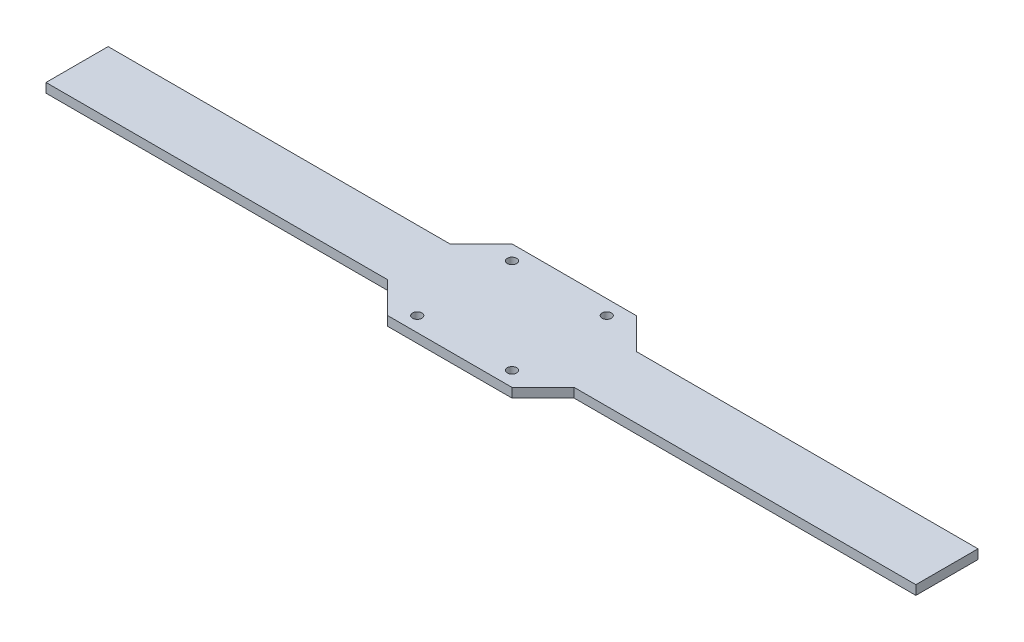
ISO-10303-21;
HEADER;
FILE_DESCRIPTION(('STEP AP214'),'2;1');
FILE_NAME('part.step','',(''),(''),'','','');
FILE_SCHEMA(('AUTOMOTIVE_DESIGN { 1 0 10303 214 1 1 1 1 }'));
ENDSEC;
DATA;
#1=APPLICATION_CONTEXT('core data for automotive mechanical design processes');
#2=APPLICATION_PROTOCOL_DEFINITION('international standard','automotive_design',2000,#1);
#3=PRODUCT_CONTEXT('',#1,'mechanical');
#4=PRODUCT('Part','Part','',(#3));
#5=PRODUCT_RELATED_PRODUCT_CATEGORY('part','',(#4));
#6=PRODUCT_DEFINITION_FORMATION('','',#4);
#7=PRODUCT_DEFINITION_CONTEXT('part definition',#1,'design');
#8=PRODUCT_DEFINITION('design','',#6,#7);
#9=PRODUCT_DEFINITION_SHAPE('','',#8);
#10=(LENGTH_UNIT() NAMED_UNIT(*) SI_UNIT(.MILLI.,.METRE.));
#11=(NAMED_UNIT(*) PLANE_ANGLE_UNIT() SI_UNIT($,.RADIAN.));
#12=(NAMED_UNIT(*) SI_UNIT($,.STERADIAN.) SOLID_ANGLE_UNIT());
#13=UNCERTAINTY_MEASURE_WITH_UNIT(LENGTH_MEASURE(1.E-05),#10,'distance_accuracy_value','');
#14=(GEOMETRIC_REPRESENTATION_CONTEXT(3) GLOBAL_UNCERTAINTY_ASSIGNED_CONTEXT((#13)) GLOBAL_UNIT_ASSIGNED_CONTEXT((#10,
#11,#12)) REPRESENTATION_CONTEXT('',''));
#15=CARTESIAN_POINT('',(0.,0.,0.));
#16=DIRECTION('',(0.,0.,1.));
#17=DIRECTION('',(1.,0.,0.));
#18=AXIS2_PLACEMENT_3D('',#15,#16,#17);
#19=CARTESIAN_POINT('',(140.,1.5,0.));
#20=DIRECTION('',(1.,0.,0.));
#21=DIRECTION('',(0.,0.,-1.));
#22=AXIS2_PLACEMENT_3D('',#19,#20,#21);
#23=PLANE('',#22);
#24=DIRECTION('',(0.,0.,1.));
#25=VECTOR('',#24,1.);
#26=CARTESIAN_POINT('',(140.,-1.5,0.));
#27=LINE('',#26,#25);
#28=CARTESIAN_POINT('',(140.,-1.5,-10.));
#29=VERTEX_POINT('',#28);
#30=CARTESIAN_POINT('',(140.,-1.5,10.));
#31=VERTEX_POINT('',#30);
#32=EDGE_CURVE('E164',#29,#31,#27,.T.);
#33=ORIENTED_EDGE('',*,*,#32,.F.);
#34=DIRECTION('',(0.,-1.,0.));
#35=VECTOR('',#34,1.);
#36=CARTESIAN_POINT('',(140.,1.5,-10.));
#37=LINE('',#36,#35);
#38=CARTESIAN_POINT('',(140.,1.5,-10.));
#39=VERTEX_POINT('',#38);
#40=EDGE_CURVE('E11',#39,#29,#37,.T.);
#41=ORIENTED_EDGE('',*,*,#40,.F.);
#42=DIRECTION('',(0.,0.,1.));
#43=VECTOR('',#42,1.);
#44=CARTESIAN_POINT('',(140.,1.5,0.));
#45=LINE('',#44,#43);
#46=CARTESIAN_POINT('',(140.,1.5,10.));
#47=VERTEX_POINT('',#46);
#48=EDGE_CURVE('E429',#39,#47,#45,.T.);
#49=ORIENTED_EDGE('',*,*,#48,.T.);
#50=DIRECTION('',(0.,-1.,0.));
#51=VECTOR('',#50,1.);
#52=CARTESIAN_POINT('',(140.,1.5,10.));
#53=LINE('',#52,#51);
#54=EDGE_CURVE('E51',#47,#31,#53,.T.);
#55=ORIENTED_EDGE('',*,*,#54,.T.);
#56=EDGE_LOOP('',(#33,#41,#49,#55));
#57=FACE_BOUND('',#56,.T.);
#58=ADVANCED_FACE('F34',(#57),#23,.T.);
#59=CARTESIAN_POINT('',(0.,1.5,-10.));
#60=DIRECTION('',(0.,0.,1.));
#61=DIRECTION('',(1.,0.,0.));
#62=AXIS2_PLACEMENT_3D('',#59,#60,#61);
#63=PLANE('',#62);
#64=DIRECTION('',(-1.,0.,0.));
#65=VECTOR('',#64,1.);
#66=CARTESIAN_POINT('',(0.,-1.5,-10.));
#67=LINE('',#66,#65);
#68=CARTESIAN_POINT('',(30.,-1.5,-10.));
#69=VERTEX_POINT('',#68);
#70=EDGE_CURVE('E166',#29,#69,#67,.T.);
#71=ORIENTED_EDGE('',*,*,#70,.T.);
#72=DIRECTION('',(0.,-1.,0.));
#73=VECTOR('',#72,1.);
#74=CARTESIAN_POINT('',(30.,1.5,-10.));
#75=LINE('',#74,#73);
#76=CARTESIAN_POINT('',(30.,1.5,-10.));
#77=VERTEX_POINT('',#76);
#78=EDGE_CURVE('E43',#77,#69,#75,.T.);
#79=ORIENTED_EDGE('',*,*,#78,.F.);
#80=DIRECTION('',(-1.,0.,0.));
#81=VECTOR('',#80,1.);
#82=CARTESIAN_POINT('',(0.,1.5,-10.));
#83=LINE('',#82,#81);
#84=EDGE_CURVE('E427',#39,#77,#83,.T.);
#85=ORIENTED_EDGE('',*,*,#84,.F.);
#86=ORIENTED_EDGE('',*,*,#40,.T.);
#87=EDGE_LOOP('',(#71,#79,#85,#86));
#88=FACE_BOUND('',#87,.T.);
#89=ADVANCED_FACE('F224',(#88),#63,.F.);
#90=CARTESIAN_POINT('',(20.,1.5,-20.));
#91=DIRECTION('',(-0.707106781186547,0.,0.707106781186547));
#92=DIRECTION('',(0.707106781186548,0.,0.707106781186548));
#93=AXIS2_PLACEMENT_3D('',#90,#91,#92);
#94=PLANE('',#93);
#95=DIRECTION('',(-0.707106781186548,0.,-0.707106781186548));
#96=VECTOR('',#95,1.);
#97=CARTESIAN_POINT('',(20.,-1.5,-20.));
#98=LINE('',#97,#96);
#99=CARTESIAN_POINT('',(20.,-1.5,-20.));
#100=VERTEX_POINT('',#99);
#101=EDGE_CURVE('E169',#69,#100,#98,.T.);
#102=ORIENTED_EDGE('',*,*,#101,.T.);
#103=DIRECTION('',(0.,-1.,0.));
#104=VECTOR('',#103,1.);
#105=CARTESIAN_POINT('',(20.,1.5,-20.));
#106=LINE('',#105,#104);
#107=CARTESIAN_POINT('',(20.,1.5,-20.));
#108=VERTEX_POINT('',#107);
#109=EDGE_CURVE('E212',#108,#100,#106,.T.);
#110=ORIENTED_EDGE('',*,*,#109,.F.);
#111=DIRECTION('',(-0.707106781186548,0.,-0.707106781186548));
#112=VECTOR('',#111,1.);
#113=CARTESIAN_POINT('',(20.,1.5,-20.));
#114=LINE('',#113,#112);
#115=EDGE_CURVE('E220',#77,#108,#114,.T.);
#116=ORIENTED_EDGE('',*,*,#115,.F.);
#117=ORIENTED_EDGE('',*,*,#78,.T.);
#118=EDGE_LOOP('',(#102,#110,#116,#117));
#119=FACE_BOUND('',#118,.T.);
#120=ADVANCED_FACE('F217',(#119),#94,.F.);
#121=CARTESIAN_POINT('',(0.,1.5,-20.));
#122=DIRECTION('',(0.,0.,1.));
#123=DIRECTION('',(1.,0.,0.));
#124=AXIS2_PLACEMENT_3D('',#121,#122,#123);
#125=PLANE('',#124);
#126=DIRECTION('',(-1.,0.,0.));
#127=VECTOR('',#126,1.);
#128=CARTESIAN_POINT('',(0.,-1.5,-20.));
#129=LINE('',#128,#127);
#130=CARTESIAN_POINT('',(-20.,-1.5,-20.));
#131=VERTEX_POINT('',#130);
#132=EDGE_CURVE('E172',#100,#131,#129,.T.);
#133=ORIENTED_EDGE('',*,*,#132,.T.);
#134=DIRECTION('',(0.,-1.,0.));
#135=VECTOR('',#134,1.);
#136=CARTESIAN_POINT('',(-20.,1.5,-20.));
#137=LINE('',#136,#135);
#138=CARTESIAN_POINT('',(-20.,1.5,-20.));
#139=VERTEX_POINT('',#138);
#140=EDGE_CURVE('E210',#139,#131,#137,.T.);
#141=ORIENTED_EDGE('',*,*,#140,.F.);
#142=DIRECTION('',(-1.,0.,0.));
#143=VECTOR('',#142,1.);
#144=CARTESIAN_POINT('',(0.,1.5,-20.));
#145=LINE('',#144,#143);
#146=EDGE_CURVE('E413',#108,#139,#145,.T.);
#147=ORIENTED_EDGE('',*,*,#146,.F.);
#148=ORIENTED_EDGE('',*,*,#109,.T.);
#149=EDGE_LOOP('',(#133,#141,#147,#148));
#150=FACE_BOUND('',#149,.T.);
#151=ADVANCED_FACE('F296',(#150),#125,.F.);
#152=CARTESIAN_POINT('',(-20.,1.5,-20.));
#153=DIRECTION('',(-0.707106781186547,0.,-0.707106781186547));
#154=DIRECTION('',(-0.707106781186548,0.,0.707106781186548));
#155=AXIS2_PLACEMENT_3D('',#152,#153,#154);
#156=PLANE('',#155);
#157=DIRECTION('',(0.707106781186548,0.,-0.707106781186548));
#158=VECTOR('',#157,1.);
#159=CARTESIAN_POINT('',(-20.,-1.5,-20.));
#160=LINE('',#159,#158);
#161=CARTESIAN_POINT('',(-30.,-1.5,-10.));
#162=VERTEX_POINT('',#161);
#163=EDGE_CURVE('E175',#162,#131,#160,.T.);
#164=ORIENTED_EDGE('',*,*,#163,.F.);
#165=DIRECTION('',(0.,-1.,0.));
#166=VECTOR('',#165,1.);
#167=CARTESIAN_POINT('',(-30.,1.5,-10.));
#168=LINE('',#167,#166);
#169=CARTESIAN_POINT('',(-30.,1.5,-10.));
#170=VERTEX_POINT('',#169);
#171=EDGE_CURVE('E208',#170,#162,#168,.T.);
#172=ORIENTED_EDGE('',*,*,#171,.F.);
#173=DIRECTION('',(0.707106781186548,0.,-0.707106781186548));
#174=VECTOR('',#173,1.);
#175=CARTESIAN_POINT('',(-20.,1.5,-20.));
#176=LINE('',#175,#174);
#177=EDGE_CURVE('E409',#170,#139,#176,.T.);
#178=ORIENTED_EDGE('',*,*,#177,.T.);
#179=ORIENTED_EDGE('',*,*,#140,.T.);
#180=EDGE_LOOP('',(#164,#172,#178,#179));
#181=FACE_BOUND('',#180,.T.);
#182=ADVANCED_FACE('F292',(#181),#156,.T.);
#183=CARTESIAN_POINT('',(0.,1.5,-9.99999999999999));
#184=DIRECTION('',(0.,0.,-1.));
#185=DIRECTION('',(-1.,0.,0.));
#186=AXIS2_PLACEMENT_3D('',#183,#184,#185);
#187=PLANE('',#186);
#188=DIRECTION('',(1.,0.,0.));
#189=VECTOR('',#188,1.);
#190=CARTESIAN_POINT('',(0.,-1.5,-9.99999999999999));
#191=LINE('',#190,#189);
#192=CARTESIAN_POINT('',(-140.,-1.5,-10.));
#193=VERTEX_POINT('',#192);
#194=EDGE_CURVE('E178',#193,#162,#191,.T.);
#195=ORIENTED_EDGE('',*,*,#194,.F.);
#196=DIRECTION('',(0.,-1.,0.));
#197=VECTOR('',#196,1.);
#198=CARTESIAN_POINT('',(-140.,1.5,-10.));
#199=LINE('',#198,#197);
#200=CARTESIAN_POINT('',(-140.,1.5,-10.));
#201=VERTEX_POINT('',#200);
#202=EDGE_CURVE('E206',#201,#193,#199,.T.);
#203=ORIENTED_EDGE('',*,*,#202,.F.);
#204=DIRECTION('',(1.,0.,0.));
#205=VECTOR('',#204,1.);
#206=CARTESIAN_POINT('',(0.,1.5,-9.99999999999999));
#207=LINE('',#206,#205);
#208=EDGE_CURVE('E412',#201,#170,#207,.T.);
#209=ORIENTED_EDGE('',*,*,#208,.T.);
#210=ORIENTED_EDGE('',*,*,#171,.T.);
#211=EDGE_LOOP('',(#195,#203,#209,#210));
#212=FACE_BOUND('',#211,.T.);
#213=ADVANCED_FACE('F288',(#212),#187,.T.);
#214=CARTESIAN_POINT('',(-140.,1.5,0.));
#215=DIRECTION('',(1.,0.,0.));
#216=DIRECTION('',(0.,0.,-1.));
#217=AXIS2_PLACEMENT_3D('',#214,#215,#216);
#218=PLANE('',#217);
#219=DIRECTION('',(0.,0.,1.));
#220=VECTOR('',#219,1.);
#221=CARTESIAN_POINT('',(-140.,-1.5,0.));
#222=LINE('',#221,#220);
#223=CARTESIAN_POINT('',(-140.,-1.5,10.));
#224=VERTEX_POINT('',#223);
#225=EDGE_CURVE('E181',#193,#224,#222,.T.);
#226=ORIENTED_EDGE('',*,*,#225,.T.);
#227=DIRECTION('',(0.,-1.,0.));
#228=VECTOR('',#227,1.);
#229=CARTESIAN_POINT('',(-140.,1.5,10.));
#230=LINE('',#229,#228);
#231=CARTESIAN_POINT('',(-140.,1.5,10.));
#232=VERTEX_POINT('',#231);
#233=EDGE_CURVE('E203',#232,#224,#230,.T.);
#234=ORIENTED_EDGE('',*,*,#233,.F.);
#235=DIRECTION('',(0.,0.,1.));
#236=VECTOR('',#235,1.);
#237=CARTESIAN_POINT('',(-140.,1.5,0.));
#238=LINE('',#237,#236);
#239=EDGE_CURVE('E415',#201,#232,#238,.T.);
#240=ORIENTED_EDGE('',*,*,#239,.F.);
#241=ORIENTED_EDGE('',*,*,#202,.T.);
#242=EDGE_LOOP('',(#226,#234,#240,#241));
#243=FACE_BOUND('',#242,.T.);
#244=ADVANCED_FACE('F284',(#243),#218,.F.);
#245=CARTESIAN_POINT('',(0.,1.5,10.));
#246=DIRECTION('',(0.,0.,-1.));
#247=DIRECTION('',(-1.,0.,0.));
#248=AXIS2_PLACEMENT_3D('',#245,#246,#247);
#249=PLANE('',#248);
#250=DIRECTION('',(1.,0.,0.));
#251=VECTOR('',#250,1.);
#252=CARTESIAN_POINT('',(0.,-1.5,10.));
#253=LINE('',#252,#251);
#254=CARTESIAN_POINT('',(-30.,-1.5,10.));
#255=VERTEX_POINT('',#254);
#256=EDGE_CURVE('E184',#224,#255,#253,.T.);
#257=ORIENTED_EDGE('',*,*,#256,.T.);
#258=DIRECTION('',(0.,-1.,0.));
#259=VECTOR('',#258,1.);
#260=CARTESIAN_POINT('',(-30.,1.5,10.));
#261=LINE('',#260,#259);
#262=CARTESIAN_POINT('',(-30.,1.5,10.));
#263=VERTEX_POINT('',#262);
#264=EDGE_CURVE('E200',#263,#255,#261,.T.);
#265=ORIENTED_EDGE('',*,*,#264,.F.);
#266=DIRECTION('',(1.,0.,0.));
#267=VECTOR('',#266,1.);
#268=CARTESIAN_POINT('',(0.,1.5,10.));
#269=LINE('',#268,#267);
#270=EDGE_CURVE('E422',#232,#263,#269,.T.);
#271=ORIENTED_EDGE('',*,*,#270,.F.);
#272=ORIENTED_EDGE('',*,*,#233,.T.);
#273=EDGE_LOOP('',(#257,#265,#271,#272));
#274=FACE_BOUND('',#273,.T.);
#275=ADVANCED_FACE('F280',(#274),#249,.F.);
#276=CARTESIAN_POINT('',(-20.,1.5,20.));
#277=DIRECTION('',(0.707106781186547,0.,-0.707106781186547));
#278=DIRECTION('',(-0.707106781186548,0.,-0.707106781186548));
#279=AXIS2_PLACEMENT_3D('',#276,#277,#278);
#280=PLANE('',#279);
#281=DIRECTION('',(0.707106781186548,0.,0.707106781186548));
#282=VECTOR('',#281,1.);
#283=CARTESIAN_POINT('',(-20.,-1.5,20.));
#284=LINE('',#283,#282);
#285=CARTESIAN_POINT('',(-20.,-1.5,20.));
#286=VERTEX_POINT('',#285);
#287=EDGE_CURVE('E187',#255,#286,#284,.T.);
#288=ORIENTED_EDGE('',*,*,#287,.T.);
#289=DIRECTION('',(0.,-1.,0.));
#290=VECTOR('',#289,1.);
#291=CARTESIAN_POINT('',(-20.,1.5,20.));
#292=LINE('',#291,#290);
#293=CARTESIAN_POINT('',(-20.,1.5,20.));
#294=VERTEX_POINT('',#293);
#295=EDGE_CURVE('E134',#294,#286,#292,.T.);
#296=ORIENTED_EDGE('',*,*,#295,.F.);
#297=DIRECTION('',(0.707106781186548,0.,0.707106781186548));
#298=VECTOR('',#297,1.);
#299=CARTESIAN_POINT('',(-20.,1.5,20.));
#300=LINE('',#299,#298);
#301=EDGE_CURVE('E143',#263,#294,#300,.T.);
#302=ORIENTED_EDGE('',*,*,#301,.F.);
#303=ORIENTED_EDGE('',*,*,#264,.T.);
#304=EDGE_LOOP('',(#288,#296,#302,#303));
#305=FACE_BOUND('',#304,.T.);
#306=ADVANCED_FACE('F277',(#305),#280,.F.);
#307=CARTESIAN_POINT('',(0.,1.5,20.));
#308=DIRECTION('',(0.,0.,1.));
#309=DIRECTION('',(1.,0.,0.));
#310=AXIS2_PLACEMENT_3D('',#307,#308,#309);
#311=PLANE('',#310);
#312=DIRECTION('',(-1.,0.,0.));
#313=VECTOR('',#312,1.);
#314=CARTESIAN_POINT('',(0.,-1.5,20.));
#315=LINE('',#314,#313);
#316=CARTESIAN_POINT('',(20.,-1.5,20.));
#317=VERTEX_POINT('',#316);
#318=EDGE_CURVE('E130',#317,#286,#315,.T.);
#319=ORIENTED_EDGE('',*,*,#318,.F.);
#320=DIRECTION('',(0.,-1.,0.));
#321=VECTOR('',#320,1.);
#322=CARTESIAN_POINT('',(20.,1.5,20.));
#323=LINE('',#322,#321);
#324=CARTESIAN_POINT('',(20.,1.5,20.));
#325=VERTEX_POINT('',#324);
#326=EDGE_CURVE('E125',#325,#317,#323,.T.);
#327=ORIENTED_EDGE('',*,*,#326,.F.);
#328=DIRECTION('',(-1.,0.,0.));
#329=VECTOR('',#328,1.);
#330=CARTESIAN_POINT('',(0.,1.5,20.));
#331=LINE('',#330,#329);
#332=EDGE_CURVE('E128',#325,#294,#331,.T.);
#333=ORIENTED_EDGE('',*,*,#332,.T.);
#334=ORIENTED_EDGE('',*,*,#295,.T.);
#335=EDGE_LOOP('',(#319,#327,#333,#334));
#336=FACE_BOUND('',#335,.T.);
#337=ADVANCED_FACE('F127',(#336),#311,.T.);
#338=CARTESIAN_POINT('',(20.,1.5,20.));
#339=DIRECTION('',(0.707106781186547,0.,0.707106781186547));
#340=DIRECTION('',(0.707106781186548,0.,-0.707106781186548));
#341=AXIS2_PLACEMENT_3D('',#338,#339,#340);
#342=PLANE('',#341);
#343=DIRECTION('',(-0.707106781186548,0.,0.707106781186548));
#344=VECTOR('',#343,1.);
#345=CARTESIAN_POINT('',(20.,-1.5,20.));
#346=LINE('',#345,#344);
#347=CARTESIAN_POINT('',(30.,-1.5,10.));
#348=VERTEX_POINT('',#347);
#349=EDGE_CURVE('E191',#348,#317,#346,.T.);
#350=ORIENTED_EDGE('',*,*,#349,.F.);
#351=DIRECTION('',(0.,-1.,0.));
#352=VECTOR('',#351,1.);
#353=CARTESIAN_POINT('',(30.,1.5,10.));
#354=LINE('',#353,#352);
#355=CARTESIAN_POINT('',(30.,1.5,10.));
#356=VERTEX_POINT('',#355);
#357=EDGE_CURVE('E88',#356,#348,#354,.T.);
#358=ORIENTED_EDGE('',*,*,#357,.F.);
#359=DIRECTION('',(-0.707106781186548,0.,0.707106781186548));
#360=VECTOR('',#359,1.);
#361=CARTESIAN_POINT('',(20.,1.5,20.));
#362=LINE('',#361,#360);
#363=EDGE_CURVE('E141',#356,#325,#362,.T.);
#364=ORIENTED_EDGE('',*,*,#363,.T.);
#365=ORIENTED_EDGE('',*,*,#326,.T.);
#366=EDGE_LOOP('',(#350,#358,#364,#365));
#367=FACE_BOUND('',#366,.T.);
#368=ADVANCED_FACE('F146',(#367),#342,.T.);
#369=CARTESIAN_POINT('',(-15.25,1.5,-15.25));
#370=DIRECTION('',(0.,-1.,0.));
#371=DIRECTION('',(0.,0.,-1.));
#372=AXIS2_PLACEMENT_3D('',#369,#370,#371);
#373=CYLINDRICAL_SURFACE('',#372,1.5);
#374=CARTESIAN_POINT('',(-15.25,1.5,-15.25));
#375=DIRECTION('',(0.,1.,0.));
#376=DIRECTION('',(0.,0.,1.));
#377=AXIS2_PLACEMENT_3D('',#374,#375,#376);
#378=CIRCLE('',#377,1.5);
#379=CARTESIAN_POINT('',(-15.25,1.5,-13.75));
#380=VERTEX_POINT('',#379);
#381=EDGE_CURVE('E431',#380,#380,#378,.T.);
#382=ORIENTED_EDGE('',*,*,#381,.T.);
#383=EDGE_LOOP('',(#382));
#384=FACE_BOUND('',#383,.T.);
#385=CARTESIAN_POINT('',(-15.25,-1.5,-15.25));
#386=DIRECTION('',(0.,1.,0.));
#387=DIRECTION('',(0.,0.,1.));
#388=AXIS2_PLACEMENT_3D('',#385,#386,#387);
#389=CIRCLE('',#388,1.5);
#390=CARTESIAN_POINT('',(-15.25,-1.5,-13.75));
#391=VERTEX_POINT('',#390);
#392=EDGE_CURVE('E161',#391,#391,#389,.T.);
#393=ORIENTED_EDGE('',*,*,#392,.F.);
#394=EDGE_LOOP('',(#393));
#395=FACE_BOUND('',#394,.T.);
#396=ADVANCED_FACE('F235',(#384,#395),#373,.F.);
#397=CARTESIAN_POINT('',(15.25,1.5,-15.25));
#398=DIRECTION('',(0.,-1.,0.));
#399=DIRECTION('',(0.,0.,-1.));
#400=AXIS2_PLACEMENT_3D('',#397,#398,#399);
#401=CYLINDRICAL_SURFACE('',#400,1.5);
#402=CARTESIAN_POINT('',(15.25,1.5,-15.25));
#403=DIRECTION('',(0.,1.,0.));
#404=DIRECTION('',(0.,0.,1.));
#405=AXIS2_PLACEMENT_3D('',#402,#403,#404);
#406=CIRCLE('',#405,1.5);
#407=CARTESIAN_POINT('',(15.25,1.5,-13.75));
#408=VERTEX_POINT('',#407);
#409=EDGE_CURVE('E434',#408,#408,#406,.T.);
#410=ORIENTED_EDGE('',*,*,#409,.T.);
#411=EDGE_LOOP('',(#410));
#412=FACE_BOUND('',#411,.T.);
#413=CARTESIAN_POINT('',(15.25,-1.5,-15.25));
#414=DIRECTION('',(0.,1.,0.));
#415=DIRECTION('',(0.,0.,1.));
#416=AXIS2_PLACEMENT_3D('',#413,#414,#415);
#417=CIRCLE('',#416,1.5);
#418=CARTESIAN_POINT('',(15.25,-1.5,-13.75));
#419=VERTEX_POINT('',#418);
#420=EDGE_CURVE('E158',#419,#419,#417,.T.);
#421=ORIENTED_EDGE('',*,*,#420,.F.);
#422=EDGE_LOOP('',(#421));
#423=FACE_BOUND('',#422,.T.);
#424=ADVANCED_FACE('F238',(#412,#423),#401,.F.);
#425=CARTESIAN_POINT('',(15.25,1.5,15.25));
#426=DIRECTION('',(0.,-1.,0.));
#427=DIRECTION('',(0.,0.,-1.));
#428=AXIS2_PLACEMENT_3D('',#425,#426,#427);
#429=CYLINDRICAL_SURFACE('',#428,1.5);
#430=CARTESIAN_POINT('',(15.25,1.5,15.25));
#431=DIRECTION('',(0.,1.,0.));
#432=DIRECTION('',(0.,0.,1.));
#433=AXIS2_PLACEMENT_3D('',#430,#431,#432);
#434=CIRCLE('',#433,1.5);
#435=CARTESIAN_POINT('',(15.25,1.5,16.75));
#436=VERTEX_POINT('',#435);
#437=EDGE_CURVE('E253',#436,#436,#434,.T.);
#438=ORIENTED_EDGE('',*,*,#437,.T.);
#439=EDGE_LOOP('',(#438));
#440=FACE_BOUND('',#439,.T.);
#441=CARTESIAN_POINT('',(15.25,-1.5,15.25));
#442=DIRECTION('',(0.,1.,0.));
#443=DIRECTION('',(0.,0.,1.));
#444=AXIS2_PLACEMENT_3D('',#441,#442,#443);
#445=CIRCLE('',#444,1.5);
#446=CARTESIAN_POINT('',(15.25,-1.5,16.75));
#447=VERTEX_POINT('',#446);
#448=EDGE_CURVE('E155',#447,#447,#445,.T.);
#449=ORIENTED_EDGE('',*,*,#448,.F.);
#450=EDGE_LOOP('',(#449));
#451=FACE_BOUND('',#450,.T.);
#452=ADVANCED_FACE('F241',(#440,#451),#429,.F.);
#453=CARTESIAN_POINT('',(-15.25,1.5,15.25));
#454=DIRECTION('',(0.,-1.,0.));
#455=DIRECTION('',(0.,0.,-1.));
#456=AXIS2_PLACEMENT_3D('',#453,#454,#455);
#457=CYLINDRICAL_SURFACE('',#456,1.5);
#458=CARTESIAN_POINT('',(-15.25,1.5,15.25));
#459=DIRECTION('',(0.,1.,0.));
#460=DIRECTION('',(0.,0.,1.));
#461=AXIS2_PLACEMENT_3D('',#458,#459,#460);
#462=CIRCLE('',#461,1.5);
#463=CARTESIAN_POINT('',(-15.25,1.5,16.75));
#464=VERTEX_POINT('',#463);
#465=EDGE_CURVE('E196',#464,#464,#462,.T.);
#466=ORIENTED_EDGE('',*,*,#465,.T.);
#467=EDGE_LOOP('',(#466));
#468=FACE_BOUND('',#467,.T.);
#469=CARTESIAN_POINT('',(-15.25,-1.5,15.25));
#470=DIRECTION('',(0.,1.,0.));
#471=DIRECTION('',(0.,0.,1.));
#472=AXIS2_PLACEMENT_3D('',#469,#470,#471);
#473=CIRCLE('',#472,1.5);
#474=CARTESIAN_POINT('',(-15.25,-1.5,16.75));
#475=VERTEX_POINT('',#474);
#476=EDGE_CURVE('E152',#475,#475,#473,.T.);
#477=ORIENTED_EDGE('',*,*,#476,.F.);
#478=EDGE_LOOP('',(#477));
#479=FACE_BOUND('',#478,.T.);
#480=ADVANCED_FACE('F36',(#468,#479),#457,.F.);
#481=CARTESIAN_POINT('',(0.,1.5,10.));
#482=DIRECTION('',(0.,0.,1.));
#483=DIRECTION('',(1.,0.,0.));
#484=AXIS2_PLACEMENT_3D('',#481,#482,#483);
#485=PLANE('',#484);
#486=DIRECTION('',(-1.,0.,0.));
#487=VECTOR('',#486,1.);
#488=CARTESIAN_POINT('',(0.,-1.5,10.));
#489=LINE('',#488,#487);
#490=EDGE_CURVE('E193',#31,#348,#489,.T.);
#491=ORIENTED_EDGE('',*,*,#490,.F.);
#492=ORIENTED_EDGE('',*,*,#54,.F.);
#493=DIRECTION('',(-1.,0.,0.));
#494=VECTOR('',#493,1.);
#495=CARTESIAN_POINT('',(0.,1.5,10.));
#496=LINE('',#495,#494);
#497=EDGE_CURVE('E147',#47,#356,#496,.T.);
#498=ORIENTED_EDGE('',*,*,#497,.T.);
#499=ORIENTED_EDGE('',*,*,#357,.T.);
#500=EDGE_LOOP('',(#491,#492,#498,#499));
#501=FACE_BOUND('',#500,.T.);
#502=ADVANCED_FACE('F248',(#501),#485,.T.);
#503=CARTESIAN_POINT('',(0.,1.5,0.));
#504=DIRECTION('',(0.,1.,0.));
#505=DIRECTION('',(0.,0.,1.));
#506=AXIS2_PLACEMENT_3D('',#503,#504,#505);
#507=PLANE('',#506);
#508=ORIENTED_EDGE('',*,*,#465,.F.);
#509=EDGE_LOOP('',(#508));
#510=FACE_BOUND('',#509,.T.);
#511=ORIENTED_EDGE('',*,*,#437,.F.);
#512=EDGE_LOOP('',(#511));
#513=FACE_BOUND('',#512,.T.);
#514=ORIENTED_EDGE('',*,*,#409,.F.);
#515=EDGE_LOOP('',(#514));
#516=FACE_BOUND('',#515,.T.);
#517=ORIENTED_EDGE('',*,*,#381,.F.);
#518=EDGE_LOOP('',(#517));
#519=FACE_BOUND('',#518,.T.);
#520=ORIENTED_EDGE('',*,*,#48,.F.);
#521=ORIENTED_EDGE('',*,*,#84,.T.);
#522=ORIENTED_EDGE('',*,*,#115,.T.);
#523=ORIENTED_EDGE('',*,*,#146,.T.);
#524=ORIENTED_EDGE('',*,*,#177,.F.);
#525=ORIENTED_EDGE('',*,*,#208,.F.);
#526=ORIENTED_EDGE('',*,*,#239,.T.);
#527=ORIENTED_EDGE('',*,*,#270,.T.);
#528=ORIENTED_EDGE('',*,*,#301,.T.);
#529=ORIENTED_EDGE('',*,*,#332,.F.);
#530=ORIENTED_EDGE('',*,*,#363,.F.);
#531=ORIENTED_EDGE('',*,*,#497,.F.);
#532=EDGE_LOOP('',(#520,#521,#522,#523,#524,#525,#526,#527,#528,#529,#530,#531));
#533=FACE_BOUND('',#532,.T.);
#534=ADVANCED_FACE('F139',(#510,#513,#516,#519,#533),#507,.T.);
#535=CARTESIAN_POINT('',(0.,-1.5,0.));
#536=DIRECTION('',(0.,1.,0.));
#537=DIRECTION('',(0.,0.,1.));
#538=AXIS2_PLACEMENT_3D('',#535,#536,#537);
#539=PLANE('',#538);
#540=ORIENTED_EDGE('',*,*,#476,.T.);
#541=EDGE_LOOP('',(#540));
#542=FACE_BOUND('',#541,.T.);
#543=ORIENTED_EDGE('',*,*,#448,.T.);
#544=EDGE_LOOP('',(#543));
#545=FACE_BOUND('',#544,.T.);
#546=ORIENTED_EDGE('',*,*,#420,.T.);
#547=EDGE_LOOP('',(#546));
#548=FACE_BOUND('',#547,.T.);
#549=ORIENTED_EDGE('',*,*,#392,.T.);
#550=EDGE_LOOP('',(#549));
#551=FACE_BOUND('',#550,.T.);
#552=ORIENTED_EDGE('',*,*,#32,.T.);
#553=ORIENTED_EDGE('',*,*,#490,.T.);
#554=ORIENTED_EDGE('',*,*,#349,.T.);
#555=ORIENTED_EDGE('',*,*,#318,.T.);
#556=ORIENTED_EDGE('',*,*,#287,.F.);
#557=ORIENTED_EDGE('',*,*,#256,.F.);
#558=ORIENTED_EDGE('',*,*,#225,.F.);
#559=ORIENTED_EDGE('',*,*,#194,.T.);
#560=ORIENTED_EDGE('',*,*,#163,.T.);
#561=ORIENTED_EDGE('',*,*,#132,.F.);
#562=ORIENTED_EDGE('',*,*,#101,.F.);
#563=ORIENTED_EDGE('',*,*,#70,.F.);
#564=EDGE_LOOP('',(#552,#553,#554,#555,#556,#557,#558,#559,#560,#561,#562,#563));
#565=FACE_BOUND('',#564,.T.);
#566=ADVANCED_FACE('F226',(#542,#545,#548,#551,#565),#539,.F.);
#567=CLOSED_SHELL('',(#58,#89,#120,#151,#182,#213,#244,#275,#306,#337,#368,#396,#424,#452,#480,
#502,#534,#566));
#568=MANIFOLD_SOLID_BREP('B2',#567);
#569=ADVANCED_BREP_SHAPE_REPRESENTATION('',(#18,#568),#14);
#570=SHAPE_DEFINITION_REPRESENTATION(#9,#569);
ENDSEC;
END-ISO-10303-21;
